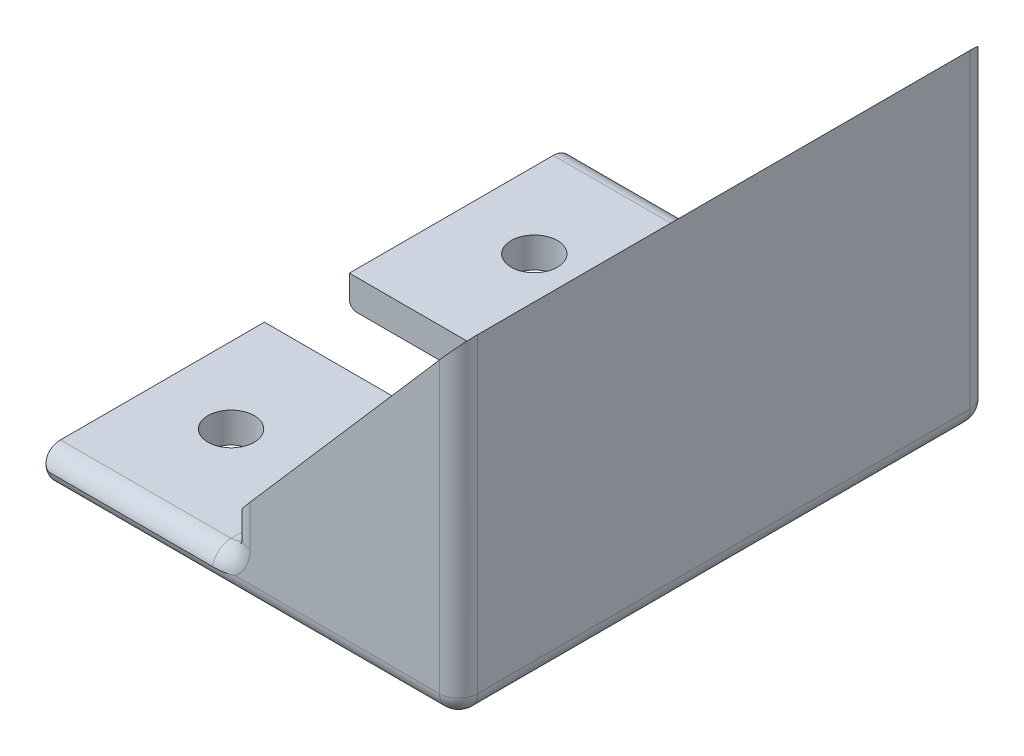
ISO-10303-21;
HEADER;
FILE_DESCRIPTION(('STEP AP214'),'2;1');
FILE_NAME('part.step','',(''),(''),'','','');
FILE_SCHEMA(('AUTOMOTIVE_DESIGN { 1 0 10303 214 1 1 1 1 }'));
ENDSEC;
DATA;
#1=APPLICATION_CONTEXT('core data for automotive mechanical design processes');
#2=APPLICATION_PROTOCOL_DEFINITION('international standard','automotive_design',2000,#1);
#3=PRODUCT_CONTEXT('',#1,'mechanical');
#4=PRODUCT('Part','Part','',(#3));
#5=PRODUCT_RELATED_PRODUCT_CATEGORY('part','',(#4));
#6=PRODUCT_DEFINITION_FORMATION('','',#4);
#7=PRODUCT_DEFINITION_CONTEXT('part definition',#1,'design');
#8=PRODUCT_DEFINITION('design','',#6,#7);
#9=PRODUCT_DEFINITION_SHAPE('','',#8);
#10=(LENGTH_UNIT() NAMED_UNIT(*) SI_UNIT(.MILLI.,.METRE.));
#11=(NAMED_UNIT(*) PLANE_ANGLE_UNIT() SI_UNIT($,.RADIAN.));
#12=(NAMED_UNIT(*) SI_UNIT($,.STERADIAN.) SOLID_ANGLE_UNIT());
#13=UNCERTAINTY_MEASURE_WITH_UNIT(LENGTH_MEASURE(1.E-05),#10,'distance_accuracy_value','');
#14=(GEOMETRIC_REPRESENTATION_CONTEXT(3) GLOBAL_UNCERTAINTY_ASSIGNED_CONTEXT((#13)) GLOBAL_UNIT_ASSIGNED_CONTEXT((#10,
#11,#12)) REPRESENTATION_CONTEXT('',''));
#15=CARTESIAN_POINT('',(0.,0.,0.));
#16=DIRECTION('',(0.,0.,1.));
#17=DIRECTION('',(1.,0.,0.));
#18=AXIS2_PLACEMENT_3D('',#15,#16,#17);
#19=CARTESIAN_POINT('',(-25.,-5.,35.));
#20=DIRECTION('',(0.,1.,0.));
#21=DIRECTION('',(0.,0.,1.));
#22=AXIS2_PLACEMENT_3D('',#19,#20,#21);
#23=PLANE('',#22);
#24=CARTESIAN_POINT('',(-15.,-5.,20.));
#25=DIRECTION('',(0.,1.,0.));
#26=DIRECTION('',(0.,0.,1.));
#27=AXIS2_PLACEMENT_3D('',#24,#25,#26);
#28=CIRCLE('',#27,3.05);
#29=CARTESIAN_POINT('',(-15.,-5.,23.05));
#30=VERTEX_POINT('',#29);
#31=EDGE_CURVE('E573',#30,#30,#28,.T.);
#32=ORIENTED_EDGE('',*,*,#31,.F.);
#33=EDGE_LOOP('',(#32));
#34=FACE_BOUND('',#33,.T.);
#35=DIRECTION('',(0.,0.,-1.));
#36=VECTOR('',#35,1.);
#37=CARTESIAN_POINT('',(-25.,-5.,35.));
#38=LINE('',#37,#36);
#39=CARTESIAN_POINT('',(-25.,-5.,32.5));
#40=VERTEX_POINT('',#39);
#41=CARTESIAN_POINT('',(-25.,-5.,5.6));
#42=VERTEX_POINT('',#41);
#43=EDGE_CURVE('E252',#40,#42,#38,.T.);
#44=ORIENTED_EDGE('',*,*,#43,.F.);
#45=DIRECTION('',(1.,0.,0.));
#46=VECTOR('',#45,1.);
#47=CARTESIAN_POINT('',(-25.,-5.,32.5));
#48=LINE('',#47,#46);
#49=CARTESIAN_POINT('',(-2.5,-5.,32.5));
#50=VERTEX_POINT('',#49);
#51=EDGE_CURVE('E325',#40,#50,#48,.T.);
#52=ORIENTED_EDGE('',*,*,#51,.T.);
#53=DIRECTION('',(0.,0.,-1.));
#54=VECTOR('',#53,1.);
#55=CARTESIAN_POINT('',(-2.5,-5.,35.));
#56=LINE('',#55,#54);
#57=CARTESIAN_POINT('',(-2.5,-5.,5.6));
#58=VERTEX_POINT('',#57);
#59=EDGE_CURVE('E322',#50,#58,#56,.T.);
#60=ORIENTED_EDGE('',*,*,#59,.T.);
#61=DIRECTION('',(1.,0.,0.));
#62=VECTOR('',#61,1.);
#63=CARTESIAN_POINT('',(-25.,-5.,5.6));
#64=LINE('',#63,#62);
#65=EDGE_CURVE('E233',#42,#58,#64,.T.);
#66=ORIENTED_EDGE('',*,*,#65,.F.);
#67=EDGE_LOOP('',(#44,#52,#60,#66));
#68=FACE_BOUND('',#67,.T.);
#69=ADVANCED_FACE('F43',(#34,#68),#23,.T.);
#70=CARTESIAN_POINT('',(-25.,-9.,35.));
#71=DIRECTION('',(-1.,0.,0.));
#72=DIRECTION('',(0.,0.,1.));
#73=AXIS2_PLACEMENT_3D('',#70,#71,#72);
#74=PLANE('',#73);
#75=DIRECTION('',(0.,0.,-1.));
#76=VECTOR('',#75,1.);
#77=CARTESIAN_POINT('',(-25.,-8.,35.));
#78=LINE('',#77,#76);
#79=CARTESIAN_POINT('',(-25.,-8.,5.6));
#80=VERTEX_POINT('',#79);
#81=CARTESIAN_POINT('',(-25.,-8.,32.5));
#82=VERTEX_POINT('',#81);
#83=EDGE_CURVE('E426',#80,#82,#78,.F.);
#84=ORIENTED_EDGE('',*,*,#83,.T.);
#85=CARTESIAN_POINT('',(-25.,-6.5,32.5));
#86=DIRECTION('',(-1.,0.,0.));
#87=DIRECTION('',(0.,0.,1.));
#88=AXIS2_PLACEMENT_3D('',#85,#86,#87);
#89=CIRCLE('',#88,1.5);
#90=EDGE_CURVE('E398',#82,#40,#89,.T.);
#91=ORIENTED_EDGE('',*,*,#90,.T.);
#92=ORIENTED_EDGE('',*,*,#43,.T.);
#93=DIRECTION('',(0.,-1.,0.));
#94=VECTOR('',#93,1.);
#95=CARTESIAN_POINT('',(-25.,-9.,5.6));
#96=LINE('',#95,#94);
#97=EDGE_CURVE('E223',#42,#80,#96,.T.);
#98=ORIENTED_EDGE('',*,*,#97,.T.);
#99=EDGE_LOOP('',(#84,#91,#92,#98));
#100=FACE_BOUND('',#99,.T.);
#101=ADVANCED_FACE('F450',(#100),#74,.T.);
#102=CARTESIAN_POINT('',(0.,0.,35.));
#103=DIRECTION('',(1.,0.,0.));
#104=DIRECTION('',(0.,1.,0.));
#105=AXIS2_PLACEMENT_3D('',#102,#103,#104);
#106=PLANE('',#105);
#107=DIRECTION('',(0.,0.,-1.));
#108=VECTOR('',#107,1.);
#109=CARTESIAN_POINT('',(0.,0.,35.));
#110=LINE('',#109,#108);
#111=CARTESIAN_POINT('',(0.,0.,32.5));
#112=VERTEX_POINT('',#111);
#113=CARTESIAN_POINT('',(0.,0.,-32.5));
#114=VERTEX_POINT('',#113);
#115=EDGE_CURVE('E241',#112,#114,#110,.T.);
#116=ORIENTED_EDGE('',*,*,#115,.T.);
#117=DIRECTION('',(0.,-1.,0.));
#118=VECTOR('',#117,1.);
#119=CARTESIAN_POINT('',(0.,0.,-32.5));
#120=LINE('',#119,#118);
#121=CARTESIAN_POINT('',(0.,-2.5,-32.5));
#122=VERTEX_POINT('',#121);
#123=EDGE_CURVE('E277',#114,#122,#120,.T.);
#124=ORIENTED_EDGE('',*,*,#123,.T.);
#125=DIRECTION('',(0.,0.,-1.));
#126=VECTOR('',#125,1.);
#127=CARTESIAN_POINT('',(0.,-2.5,35.));
#128=LINE('',#127,#126);
#129=CARTESIAN_POINT('',(0.,-2.5,-5.6));
#130=VERTEX_POINT('',#129);
#131=EDGE_CURVE('E274',#122,#130,#128,.F.);
#132=ORIENTED_EDGE('',*,*,#131,.T.);
#133=DIRECTION('',(0.,1.,0.));
#134=VECTOR('',#133,1.);
#135=CARTESIAN_POINT('',(0.,-8.99999999999999,-5.6));
#136=LINE('',#135,#134);
#137=CARTESIAN_POINT('',(0.,-9.,-5.6));
#138=VERTEX_POINT('',#137);
#139=EDGE_CURVE('E219',#138,#130,#136,.T.);
#140=ORIENTED_EDGE('',*,*,#139,.F.);
#141=DIRECTION('',(0.,0.,-1.));
#142=VECTOR('',#141,1.);
#143=CARTESIAN_POINT('',(0.,-9.,5.6));
#144=LINE('',#143,#142);
#145=CARTESIAN_POINT('',(0.,-9.,5.6));
#146=VERTEX_POINT('',#145);
#147=EDGE_CURVE('E197',#146,#138,#144,.T.);
#148=ORIENTED_EDGE('',*,*,#147,.F.);
#149=DIRECTION('',(0.,-1.,0.));
#150=VECTOR('',#149,1.);
#151=CARTESIAN_POINT('',(0.,-9.,5.6));
#152=LINE('',#151,#150);
#153=CARTESIAN_POINT('',(0.,-2.5,5.6));
#154=VERTEX_POINT('',#153);
#155=EDGE_CURVE('E205',#154,#146,#152,.T.);
#156=ORIENTED_EDGE('',*,*,#155,.F.);
#157=DIRECTION('',(0.,0.,-1.));
#158=VECTOR('',#157,1.);
#159=CARTESIAN_POINT('',(0.,-2.5,35.));
#160=LINE('',#159,#158);
#161=CARTESIAN_POINT('',(0.,-2.5,32.5));
#162=VERTEX_POINT('',#161);
#163=EDGE_CURVE('E268',#154,#162,#160,.F.);
#164=ORIENTED_EDGE('',*,*,#163,.T.);
#165=DIRECTION('',(0.,-1.,0.));
#166=VECTOR('',#165,1.);
#167=CARTESIAN_POINT('',(0.,0.,32.5));
#168=LINE('',#167,#166);
#169=EDGE_CURVE('E271',#162,#112,#168,.F.);
#170=ORIENTED_EDGE('',*,*,#169,.T.);
#171=EDGE_LOOP('',(#116,#124,#132,#140,#148,#156,#164,#170));
#172=FACE_BOUND('',#171,.T.);
#173=ADVANCED_FACE('F217',(#172),#106,.F.);
#174=CARTESIAN_POINT('',(-15.,-5.,-20.));
#175=DIRECTION('',(0.,1.,0.));
#176=DIRECTION('',(0.,0.,-1.));
#177=AXIS2_PLACEMENT_3D('',#174,#175,#176);
#178=CIRCLE('',#177,3.05);
#179=CARTESIAN_POINT('',(-15.,-5.,-23.05));
#180=VERTEX_POINT('',#179);
#181=EDGE_CURVE('E473',#180,#180,#178,.T.);
#182=ORIENTED_EDGE('',*,*,#181,.F.);
#183=EDGE_LOOP('',(#182));
#184=FACE_BOUND('',#183,.T.);
#185=DIRECTION('',(0.,0.,-1.));
#186=VECTOR('',#185,1.);
#187=CARTESIAN_POINT('',(-2.5,-5.,35.));
#188=LINE('',#187,#186);
#189=CARTESIAN_POINT('',(-2.5,-5.,-5.6));
#190=VERTEX_POINT('',#189);
#191=CARTESIAN_POINT('',(-2.5,-5.,-32.5));
#192=VERTEX_POINT('',#191);
#193=EDGE_CURVE('E328',#190,#192,#188,.T.);
#194=ORIENTED_EDGE('',*,*,#193,.T.);
#195=DIRECTION('',(1.,0.,0.));
#196=VECTOR('',#195,1.);
#197=CARTESIAN_POINT('',(-25.,-5.,-32.5));
#198=LINE('',#197,#196);
#199=CARTESIAN_POINT('',(-25.,-5.,-32.5));
#200=VERTEX_POINT('',#199);
#201=EDGE_CURVE('E331',#192,#200,#198,.F.);
#202=ORIENTED_EDGE('',*,*,#201,.T.);
#203=CARTESIAN_POINT('',(-25.,-5.,-5.6));
#204=VERTEX_POINT('',#203);
#205=EDGE_CURVE('E251',#204,#200,#38,.T.);
#206=ORIENTED_EDGE('',*,*,#205,.F.);
#207=DIRECTION('',(-1.,0.,0.));
#208=VECTOR('',#207,1.);
#209=CARTESIAN_POINT('',(-25.,-5.,-5.6));
#210=LINE('',#209,#208);
#211=EDGE_CURVE('E228',#190,#204,#210,.T.);
#212=ORIENTED_EDGE('',*,*,#211,.F.);
#213=EDGE_LOOP('',(#194,#202,#206,#212));
#214=FACE_BOUND('',#213,.T.);
#215=ADVANCED_FACE('F453',(#184,#214),#23,.T.);
#216=ORIENTED_EDGE('',*,*,#205,.T.);
#217=CARTESIAN_POINT('',(-25.,-6.5,-32.5));
#218=DIRECTION('',(-1.,0.,0.));
#219=DIRECTION('',(0.,0.,1.));
#220=AXIS2_PLACEMENT_3D('',#217,#218,#219);
#221=CIRCLE('',#220,1.5);
#222=CARTESIAN_POINT('',(-25.,-8.,-32.5));
#223=VERTEX_POINT('',#222);
#224=EDGE_CURVE('E504',#200,#223,#221,.T.);
#225=ORIENTED_EDGE('',*,*,#224,.T.);
#226=DIRECTION('',(0.,0.,-1.));
#227=VECTOR('',#226,1.);
#228=CARTESIAN_POINT('',(-25.,-8.,35.));
#229=LINE('',#228,#227);
#230=CARTESIAN_POINT('',(-25.,-8.,-5.6));
#231=VERTEX_POINT('',#230);
#232=EDGE_CURVE('E340',#223,#231,#229,.F.);
#233=ORIENTED_EDGE('',*,*,#232,.T.);
#234=DIRECTION('',(0.,1.,0.));
#235=VECTOR('',#234,1.);
#236=CARTESIAN_POINT('',(-25.,-8.99999999999999,-5.6));
#237=LINE('',#236,#235);
#238=EDGE_CURVE('E202',#231,#204,#237,.T.);
#239=ORIENTED_EDGE('',*,*,#238,.T.);
#240=EDGE_LOOP('',(#216,#225,#233,#239));
#241=FACE_BOUND('',#240,.T.);
#242=ADVANCED_FACE('F459',(#241),#74,.T.);
#243=CARTESIAN_POINT('',(30.,-9.,35.));
#244=DIRECTION('',(0.,-1.,0.));
#245=DIRECTION('',(1.,0.,0.));
#246=AXIS2_PLACEMENT_3D('',#243,#244,#245);
#247=PLANE('',#246);
#248=CARTESIAN_POINT('',(-15.,-9.,20.));
#249=DIRECTION('',(0.,1.,0.));
#250=DIRECTION('',(0.,0.,1.));
#251=AXIS2_PLACEMENT_3D('',#248,#249,#250);
#252=CIRCLE('',#251,3.05);
#253=CARTESIAN_POINT('',(-15.,-9.,23.05));
#254=VERTEX_POINT('',#253);
#255=EDGE_CURVE('E213',#254,#254,#252,.T.);
#256=ORIENTED_EDGE('',*,*,#255,.T.);
#257=EDGE_LOOP('',(#256));
#258=FACE_BOUND('',#257,.T.);
#259=CARTESIAN_POINT('',(-15.,-9.,-20.));
#260=DIRECTION('',(0.,1.,0.));
#261=DIRECTION('',(0.,0.,-1.));
#262=AXIS2_PLACEMENT_3D('',#259,#260,#261);
#263=CIRCLE('',#262,3.05);
#264=CARTESIAN_POINT('',(-15.,-9.,-23.05));
#265=VERTEX_POINT('',#264);
#266=EDGE_CURVE('E569',#265,#265,#263,.T.);
#267=ORIENTED_EDGE('',*,*,#266,.T.);
#268=EDGE_LOOP('',(#267));
#269=FACE_BOUND('',#268,.T.);
#270=DIRECTION('',(1.,0.,0.));
#271=VECTOR('',#270,1.);
#272=CARTESIAN_POINT('',(-25.,-8.99999999999999,-5.6));
#273=LINE('',#272,#271);
#274=CARTESIAN_POINT('',(-24.,-8.99999999999999,-5.6));
#275=VERTEX_POINT('',#274);
#276=EDGE_CURVE('E201',#275,#138,#273,.T.);
#277=ORIENTED_EDGE('',*,*,#276,.F.);
#278=DIRECTION('',(0.,0.,-1.));
#279=VECTOR('',#278,1.);
#280=CARTESIAN_POINT('',(-24.,-9.,35.));
#281=LINE('',#280,#279);
#282=CARTESIAN_POINT('',(-24.,-9.,-32.5));
#283=VERTEX_POINT('',#282);
#284=EDGE_CURVE('E544',#275,#283,#281,.T.);
#285=ORIENTED_EDGE('',*,*,#284,.T.);
#286=DIRECTION('',(-1.,0.,0.));
#287=VECTOR('',#286,1.);
#288=CARTESIAN_POINT('',(30.,-9.,-32.5));
#289=LINE('',#288,#287);
#290=CARTESIAN_POINT('',(27.5,-9.,-32.5));
#291=VERTEX_POINT('',#290);
#292=EDGE_CURVE('E313',#283,#291,#289,.F.);
#293=ORIENTED_EDGE('',*,*,#292,.T.);
#294=DIRECTION('',(0.,0.,-1.));
#295=VECTOR('',#294,1.);
#296=CARTESIAN_POINT('',(27.5,-9.,35.));
#297=LINE('',#296,#295);
#298=CARTESIAN_POINT('',(27.5,-9.,32.5));
#299=VERTEX_POINT('',#298);
#300=EDGE_CURVE('E316',#291,#299,#297,.F.);
#301=ORIENTED_EDGE('',*,*,#300,.T.);
#302=DIRECTION('',(-1.,0.,0.));
#303=VECTOR('',#302,1.);
#304=CARTESIAN_POINT('',(30.,-9.,32.5));
#305=LINE('',#304,#303);
#306=CARTESIAN_POINT('',(-24.,-9.,32.5));
#307=VERTEX_POINT('',#306);
#308=EDGE_CURVE('E319',#299,#307,#305,.T.);
#309=ORIENTED_EDGE('',*,*,#308,.T.);
#310=DIRECTION('',(0.,0.,-1.));
#311=VECTOR('',#310,1.);
#312=CARTESIAN_POINT('',(-24.,-9.,35.));
#313=LINE('',#312,#311);
#314=CARTESIAN_POINT('',(-24.,-9.,5.6));
#315=VERTEX_POINT('',#314);
#316=EDGE_CURVE('E68',#307,#315,#313,.T.);
#317=ORIENTED_EDGE('',*,*,#316,.T.);
#318=DIRECTION('',(1.,0.,0.));
#319=VECTOR('',#318,1.);
#320=CARTESIAN_POINT('',(-25.,-9.,5.6));
#321=LINE('',#320,#319);
#322=EDGE_CURVE('E193',#315,#146,#321,.T.);
#323=ORIENTED_EDGE('',*,*,#322,.T.);
#324=ORIENTED_EDGE('',*,*,#147,.T.);
#325=EDGE_LOOP('',(#277,#285,#293,#301,#309,#317,#323,#324));
#326=FACE_BOUND('',#325,.T.);
#327=ADVANCED_FACE('F195',(#258,#269,#326),#247,.T.);
#328=CARTESIAN_POINT('',(30.,34.5110522166304,35.));
#329=DIRECTION('',(1.,0.,0.));
#330=DIRECTION('',(0.,1.,0.));
#331=AXIS2_PLACEMENT_3D('',#328,#329,#330);
#332=PLANE('',#331);
#333=DIRECTION('',(0.,0.,-1.));
#334=VECTOR('',#333,1.);
#335=CARTESIAN_POINT('',(30.,-6.49999999999999,35.));
#336=LINE('',#335,#334);
#337=CARTESIAN_POINT('',(30.,-6.49999999999999,32.5));
#338=VERTEX_POINT('',#337);
#339=CARTESIAN_POINT('',(30.,-6.49999999999999,-32.5));
#340=VERTEX_POINT('',#339);
#341=EDGE_CURVE('E307',#338,#340,#336,.T.);
#342=ORIENTED_EDGE('',*,*,#341,.T.);
#343=DIRECTION('',(0.,-1.,0.));
#344=VECTOR('',#343,1.);
#345=CARTESIAN_POINT('',(30.,34.5110522166304,-32.5));
#346=LINE('',#345,#344);
#347=CARTESIAN_POINT('',(30.,34.5110522166304,-32.5));
#348=VERTEX_POINT('',#347);
#349=EDGE_CURVE('E310',#340,#348,#346,.F.);
#350=ORIENTED_EDGE('',*,*,#349,.T.);
#351=DIRECTION('',(0.,0.,-1.));
#352=VECTOR('',#351,1.);
#353=CARTESIAN_POINT('',(30.,34.5110522166304,35.));
#354=LINE('',#353,#352);
#355=CARTESIAN_POINT('',(30.,34.5110522166304,32.5));
#356=VERTEX_POINT('',#355);
#357=EDGE_CURVE('E247',#356,#348,#354,.T.);
#358=ORIENTED_EDGE('',*,*,#357,.F.);
#359=DIRECTION('',(0.,-1.,0.));
#360=VECTOR('',#359,1.);
#361=CARTESIAN_POINT('',(30.,34.5110522166304,32.5));
#362=LINE('',#361,#360);
#363=EDGE_CURVE('E304',#356,#338,#362,.T.);
#364=ORIENTED_EDGE('',*,*,#363,.T.);
#365=EDGE_LOOP('',(#342,#350,#358,#364));
#366=FACE_BOUND('',#365,.T.);
#367=ADVANCED_FACE('F609',(#366),#332,.T.);
#368=CARTESIAN_POINT('',(0.,0.,35.));
#369=DIRECTION('',(-0.754709580222773,0.656059028990506,0.));
#370=DIRECTION('',(-0.656059028990506,-0.754709580222773,0.));
#371=AXIS2_PLACEMENT_3D('',#368,#369,#370);
#372=PLANE('',#371);
#373=ORIENTED_EDGE('',*,*,#115,.F.);
#374=CARTESIAN_POINT('',(2.5,2.87592101805253,32.5));
#375=DIRECTION('',(-0.754709580222773,0.656059028990506,0.));
#376=DIRECTION('',(0.656059028990506,0.754709580222773,0.));
#377=AXIS2_PLACEMENT_3D('',#374,#375,#376);
#378=ELLIPSE('',#377,3.81063271676454,2.5);
#379=CARTESIAN_POINT('',(2.5,2.87592101805253,35.));
#380=VERTEX_POINT('',#379);
#381=EDGE_CURVE('E289',#112,#380,#378,.T.);
#382=ORIENTED_EDGE('',*,*,#381,.T.);
#383=DIRECTION('',(0.656059028990506,0.754709580222773,0.));
#384=VECTOR('',#383,1.);
#385=CARTESIAN_POINT('',(0.,0.,35.));
#386=LINE('',#385,#384);
#387=CARTESIAN_POINT('',(27.5,31.6351311985779,35.));
#388=VERTEX_POINT('',#387);
#389=EDGE_CURVE('E237',#380,#388,#386,.T.);
#390=ORIENTED_EDGE('',*,*,#389,.T.);
#391=CARTESIAN_POINT('',(27.5,31.6351311985779,32.5));
#392=DIRECTION('',(-0.754709580222773,0.656059028990506,0.));
#393=DIRECTION('',(-0.656059028990506,-0.754709580222773,0.));
#394=AXIS2_PLACEMENT_3D('',#391,#392,#393);
#395=ELLIPSE('',#394,3.81063271676454,2.5);
#396=EDGE_CURVE('E280',#388,#356,#395,.T.);
#397=ORIENTED_EDGE('',*,*,#396,.T.);
#398=ORIENTED_EDGE('',*,*,#357,.T.);
#399=CARTESIAN_POINT('',(27.5,31.6351311985779,-32.5));
#400=DIRECTION('',(-0.754709580222773,0.656059028990506,0.));
#401=DIRECTION('',(0.656059028990506,0.754709580222773,0.));
#402=AXIS2_PLACEMENT_3D('',#399,#400,#401);
#403=ELLIPSE('',#402,3.81063271676454,2.5);
#404=CARTESIAN_POINT('',(27.5,31.6351311985779,-35.));
#405=VERTEX_POINT('',#404);
#406=EDGE_CURVE('E283',#348,#405,#403,.T.);
#407=ORIENTED_EDGE('',*,*,#406,.T.);
#408=DIRECTION('',(0.656059028990506,0.754709580222773,0.));
#409=VECTOR('',#408,1.);
#410=CARTESIAN_POINT('',(0.,0.,-35.));
#411=LINE('',#410,#409);
#412=CARTESIAN_POINT('',(2.5,2.87592101805253,-35.));
#413=VERTEX_POINT('',#412);
#414=EDGE_CURVE('E236',#413,#405,#411,.T.);
#415=ORIENTED_EDGE('',*,*,#414,.F.);
#416=CARTESIAN_POINT('',(2.5,2.87592101805253,-32.5));
#417=DIRECTION('',(-0.754709580222773,0.656059028990506,0.));
#418=DIRECTION('',(-0.656059028990506,-0.754709580222773,0.));
#419=AXIS2_PLACEMENT_3D('',#416,#417,#418);
#420=ELLIPSE('',#419,3.81063271676454,2.5);
#421=EDGE_CURVE('E286',#413,#114,#420,.T.);
#422=ORIENTED_EDGE('',*,*,#421,.T.);
#423=EDGE_LOOP('',(#373,#382,#390,#397,#398,#407,#415,#422));
#424=FACE_BOUND('',#423,.T.);
#425=ADVANCED_FACE('F602',(#424),#372,.T.);
#426=CARTESIAN_POINT('',(0.,0.,35.));
#427=DIRECTION('',(0.,0.,1.));
#428=DIRECTION('',(1.,0.,0.));
#429=AXIS2_PLACEMENT_3D('',#426,#427,#428);
#430=PLANE('',#429);
#431=ORIENTED_EDGE('',*,*,#389,.F.);
#432=DIRECTION('',(0.,-1.,0.));
#433=VECTOR('',#432,1.);
#434=CARTESIAN_POINT('',(2.5,-5.,35.));
#435=LINE('',#434,#433);
#436=CARTESIAN_POINT('',(2.5,-2.5,35.));
#437=VERTEX_POINT('',#436);
#438=EDGE_CURVE('E264',#380,#437,#435,.T.);
#439=ORIENTED_EDGE('',*,*,#438,.T.);
#440=CARTESIAN_POINT('',(-2.5,-2.5,35.));
#441=DIRECTION('',(0.,0.,1.));
#442=DIRECTION('',(1.,0.,0.));
#443=AXIS2_PLACEMENT_3D('',#440,#441,#442);
#444=CIRCLE('',#443,5.);
#445=CARTESIAN_POINT('',(0.500000000000004,-6.5,35.));
#446=VERTEX_POINT('',#445);
#447=EDGE_CURVE('E261',#437,#446,#444,.F.);
#448=ORIENTED_EDGE('',*,*,#447,.T.);
#449=DIRECTION('',(-1.,0.,0.));
#450=VECTOR('',#449,1.);
#451=CARTESIAN_POINT('',(0.,-6.5,35.));
#452=LINE('',#451,#450);
#453=CARTESIAN_POINT('',(27.5,-6.5,35.));
#454=VERTEX_POINT('',#453);
#455=EDGE_CURVE('E255',#446,#454,#452,.F.);
#456=ORIENTED_EDGE('',*,*,#455,.T.);
#457=DIRECTION('',(0.,-1.,0.));
#458=VECTOR('',#457,1.);
#459=CARTESIAN_POINT('',(27.5,0.,35.));
#460=LINE('',#459,#458);
#461=EDGE_CURVE('E258',#454,#388,#460,.F.);
#462=ORIENTED_EDGE('',*,*,#461,.T.);
#463=EDGE_LOOP('',(#431,#439,#448,#456,#462));
#464=FACE_BOUND('',#463,.T.);
#465=ADVANCED_FACE('F599',(#464),#430,.T.);
#466=CARTESIAN_POINT('',(0.,0.,-35.));
#467=DIRECTION('',(0.,0.,1.));
#468=DIRECTION('',(1.,0.,0.));
#469=AXIS2_PLACEMENT_3D('',#466,#467,#468);
#470=PLANE('',#469);
#471=CARTESIAN_POINT('',(-2.5,-2.5,-35.));
#472=DIRECTION('',(0.,0.,1.));
#473=DIRECTION('',(1.,0.,0.));
#474=AXIS2_PLACEMENT_3D('',#471,#472,#473);
#475=CIRCLE('',#474,5.);
#476=CARTESIAN_POINT('',(0.500000000000004,-6.5,-35.));
#477=VERTEX_POINT('',#476);
#478=CARTESIAN_POINT('',(2.5,-2.5,-35.));
#479=VERTEX_POINT('',#478);
#480=EDGE_CURVE('E292',#477,#479,#475,.T.);
#481=ORIENTED_EDGE('',*,*,#480,.T.);
#482=DIRECTION('',(0.,-1.,0.));
#483=VECTOR('',#482,1.);
#484=CARTESIAN_POINT('',(2.5,0.,-35.));
#485=LINE('',#484,#483);
#486=EDGE_CURVE('E301',#479,#413,#485,.F.);
#487=ORIENTED_EDGE('',*,*,#486,.T.);
#488=ORIENTED_EDGE('',*,*,#414,.T.);
#489=DIRECTION('',(0.,-1.,0.));
#490=VECTOR('',#489,1.);
#491=CARTESIAN_POINT('',(27.5,-9.,-35.));
#492=LINE('',#491,#490);
#493=CARTESIAN_POINT('',(27.5,-6.5,-35.));
#494=VERTEX_POINT('',#493);
#495=EDGE_CURVE('E298',#405,#494,#492,.T.);
#496=ORIENTED_EDGE('',*,*,#495,.T.);
#497=DIRECTION('',(-1.,0.,0.));
#498=VECTOR('',#497,1.);
#499=CARTESIAN_POINT('',(-25.,-6.5,-35.));
#500=LINE('',#499,#498);
#501=EDGE_CURVE('E295',#494,#477,#500,.T.);
#502=ORIENTED_EDGE('',*,*,#501,.T.);
#503=EDGE_LOOP('',(#481,#487,#488,#496,#502));
#504=FACE_BOUND('',#503,.T.);
#505=ADVANCED_FACE('F598',(#504),#470,.F.);
#506=CARTESIAN_POINT('',(-25.,-9.,5.6));
#507=DIRECTION('',(0.,0.,1.));
#508=DIRECTION('',(1.,0.,0.));
#509=AXIS2_PLACEMENT_3D('',#506,#507,#508);
#510=PLANE('',#509);
#511=ORIENTED_EDGE('',*,*,#322,.F.);
#512=CARTESIAN_POINT('',(-24.,-8.,5.6));
#513=DIRECTION('',(0.,0.,1.));
#514=DIRECTION('',(1.,0.,0.));
#515=AXIS2_PLACEMENT_3D('',#512,#513,#514);
#516=CIRCLE('',#515,1.);
#517=EDGE_CURVE('E11',#315,#80,#516,.F.);
#518=ORIENTED_EDGE('',*,*,#517,.T.);
#519=ORIENTED_EDGE('',*,*,#97,.F.);
#520=ORIENTED_EDGE('',*,*,#65,.T.);
#521=CARTESIAN_POINT('',(-2.5,-2.5,5.6));
#522=DIRECTION('',(0.,0.,1.));
#523=DIRECTION('',(1.,0.,0.));
#524=AXIS2_PLACEMENT_3D('',#521,#522,#523);
#525=CIRCLE('',#524,2.5);
#526=EDGE_CURVE('E209',#58,#154,#525,.T.);
#527=ORIENTED_EDGE('',*,*,#526,.T.);
#528=ORIENTED_EDGE('',*,*,#155,.T.);
#529=EDGE_LOOP('',(#511,#518,#519,#520,#527,#528));
#530=FACE_BOUND('',#529,.T.);
#531=ADVANCED_FACE('F206',(#530),#510,.F.);
#532=CARTESIAN_POINT('',(-25.,-8.99999999999999,-5.6));
#533=DIRECTION('',(0.,0.,-1.));
#534=DIRECTION('',(0.,1.,0.));
#535=AXIS2_PLACEMENT_3D('',#532,#533,#534);
#536=PLANE('',#535);
#537=ORIENTED_EDGE('',*,*,#238,.F.);
#538=CARTESIAN_POINT('',(-24.,-8.,-5.6));
#539=DIRECTION('',(0.,0.,-1.));
#540=DIRECTION('',(0.,1.,0.));
#541=AXIS2_PLACEMENT_3D('',#538,#539,#540);
#542=CIRCLE('',#541,1.);
#543=EDGE_CURVE('E53',#231,#275,#542,.F.);
#544=ORIENTED_EDGE('',*,*,#543,.T.);
#545=ORIENTED_EDGE('',*,*,#276,.T.);
#546=ORIENTED_EDGE('',*,*,#139,.T.);
#547=CARTESIAN_POINT('',(-2.5,-2.5,-5.6));
#548=DIRECTION('',(0.,0.,-1.));
#549=DIRECTION('',(0.,1.,0.));
#550=AXIS2_PLACEMENT_3D('',#547,#548,#549);
#551=CIRCLE('',#550,2.5);
#552=EDGE_CURVE('E335',#130,#190,#551,.T.);
#553=ORIENTED_EDGE('',*,*,#552,.T.);
#554=ORIENTED_EDGE('',*,*,#211,.T.);
#555=EDGE_LOOP('',(#537,#544,#545,#546,#553,#554));
#556=FACE_BOUND('',#555,.T.);
#557=ADVANCED_FACE('F590',(#556),#536,.F.);
#558=CARTESIAN_POINT('',(-15.,-9.,-20.));
#559=DIRECTION('',(0.,1.,0.));
#560=DIRECTION('',(0.,0.,1.));
#561=AXIS2_PLACEMENT_3D('',#558,#559,#560);
#562=CYLINDRICAL_SURFACE('',#561,3.05);
#563=ORIENTED_EDGE('',*,*,#266,.F.);
#564=EDGE_LOOP('',(#563));
#565=FACE_BOUND('',#564,.T.);
#566=ORIENTED_EDGE('',*,*,#181,.T.);
#567=EDGE_LOOP('',(#566));
#568=FACE_BOUND('',#567,.T.);
#569=ADVANCED_FACE('F585',(#565,#568),#562,.F.);
#570=CARTESIAN_POINT('',(-15.,-9.,20.));
#571=DIRECTION('',(0.,1.,0.));
#572=DIRECTION('',(0.,0.,1.));
#573=AXIS2_PLACEMENT_3D('',#570,#571,#572);
#574=CYLINDRICAL_SURFACE('',#573,3.05);
#575=ORIENTED_EDGE('',*,*,#255,.F.);
#576=EDGE_LOOP('',(#575));
#577=FACE_BOUND('',#576,.T.);
#578=ORIENTED_EDGE('',*,*,#31,.T.);
#579=EDGE_LOOP('',(#578));
#580=FACE_BOUND('',#579,.T.);
#581=ADVANCED_FACE('F446',(#577,#580),#574,.F.);
#582=CARTESIAN_POINT('',(2.5,0.,-32.5));
#583=DIRECTION('',(0.,-1.,0.));
#584=DIRECTION('',(1.,0.,0.));
#585=AXIS2_PLACEMENT_3D('',#582,#583,#584);
#586=CYLINDRICAL_SURFACE('',#585,2.5);
#587=ORIENTED_EDGE('',*,*,#421,.F.);
#588=ORIENTED_EDGE('',*,*,#486,.F.);
#589=CARTESIAN_POINT('',(2.5,-2.5,-32.5));
#590=DIRECTION('',(0.,-1.,0.));
#591=DIRECTION('',(1.,0.,0.));
#592=AXIS2_PLACEMENT_3D('',#589,#590,#591);
#593=CIRCLE('',#592,2.5);
#594=EDGE_CURVE('E487',#122,#479,#593,.T.);
#595=ORIENTED_EDGE('',*,*,#594,.F.);
#596=ORIENTED_EDGE('',*,*,#123,.F.);
#597=EDGE_LOOP('',(#587,#588,#595,#596));
#598=FACE_BOUND('',#597,.T.);
#599=ADVANCED_FACE('F415',(#598),#586,.T.);
#600=CARTESIAN_POINT('',(-2.5,-2.5,35.));
#601=DIRECTION('',(0.,0.,-1.));
#602=DIRECTION('',(-1.,0.,0.));
#603=AXIS2_PLACEMENT_3D('',#600,#601,#602);
#604=CYLINDRICAL_SURFACE('',#603,2.5);
#605=ORIENTED_EDGE('',*,*,#552,.F.);
#606=ORIENTED_EDGE('',*,*,#131,.F.);
#607=CARTESIAN_POINT('',(-2.5,-2.5,-32.5));
#608=DIRECTION('',(0.,0.,1.));
#609=DIRECTION('',(1.,0.,0.));
#610=AXIS2_PLACEMENT_3D('',#607,#608,#609);
#611=CIRCLE('',#610,2.5);
#612=EDGE_CURVE('E482',#192,#122,#611,.T.);
#613=ORIENTED_EDGE('',*,*,#612,.F.);
#614=ORIENTED_EDGE('',*,*,#193,.F.);
#615=EDGE_LOOP('',(#605,#606,#613,#614));
#616=FACE_BOUND('',#615,.T.);
#617=ADVANCED_FACE('F437',(#616),#604,.F.);
#618=CARTESIAN_POINT('',(-2.5,-2.5,-32.5));
#619=DIRECTION('',(0.,0.,1.));
#620=DIRECTION('',(1.,0.,0.));
#621=AXIS2_PLACEMENT_3D('',#618,#619,#620);
#622=TOROIDAL_SURFACE('',#621,5.,2.5);
#623=CARTESIAN_POINT('',(-2.5,-7.5,-32.5));
#624=DIRECTION('',(1.,0.,0.));
#625=DIRECTION('',(0.,0.,-1.));
#626=AXIS2_PLACEMENT_3D('',#623,#624,#625);
#627=CIRCLE('',#626,2.5);
#628=CARTESIAN_POINT('',(-2.5,-7.,-34.9494897427832));
#629=VERTEX_POINT('',#628);
#630=EDGE_CURVE('E488',#192,#629,#627,.F.);
#631=ORIENTED_EDGE('',*,*,#630,.F.);
#632=ORIENTED_EDGE('',*,*,#612,.T.);
#633=ORIENTED_EDGE('',*,*,#594,.T.);
#634=ORIENTED_EDGE('',*,*,#480,.F.);
#635=CARTESIAN_POINT('',(-2.5002,-6.99999999777778,-34.9494897432368));
#636=CARTESIAN_POINT('',(-2.37261258090405,-7.00000976685394,-34.9494683180478));
#637=CARTESIAN_POINT('',(-2.24502871925655,-6.99729277519816,-34.9500419032741));
#638=CARTESIAN_POINT('',(-1.99011025623532,-6.98645688561193,-34.9522266145047));
#639=CARTESIAN_POINT('',(-1.86277563390686,-6.97833846325678,-34.9538376491651));
#640=CARTESIAN_POINT('',(-1.60858750545383,-6.95675235193907,-34.9579446310799));
#641=CARTESIAN_POINT('',(-1.48173395412004,-6.9432851788728,-34.9604404929885));
#642=CARTESIAN_POINT('',(-1.22871405704445,-6.91110236883992,-34.9660209065554));
#643=CARTESIAN_POINT('',(-1.10254771522599,-6.89238670194112,-34.969105461571));
#644=CARTESIAN_POINT('',(-0.728439682231576,-6.82906751859244,-34.9786184295511));
#645=CARTESIAN_POINT('',(-0.481737661628692,-6.77701781229302,-34.9853741231798));
#646=CARTESIAN_POINT('',(0.00686979219720503,-6.65418160997551,-34.9959978851492));
#647=CARTESIAN_POINT('',(0.248778111813388,-6.58340678151381,-34.999867745928));
#648=CARTESIAN_POINT('',(0.491834225553984,-6.50271915126138,-34.9999988824484));
#649=CARTESIAN_POINT('',(0.495917543158901,-6.50136082328495,-34.999999993308));
#650=CARTESIAN_POINT('',(0.500000000000004,-6.5,-35.));
#651=B_SPLINE_CURVE_WITH_KNOTS('',3,(#635,#636,#637,#638,#639,#640,#641,#642,#643,#644,#645,
#646,#647,#648,#649,#650),.UNSPECIFIED.,.F.,.F.,(4,2,2,2,2,2,2,4),(0.,0.382725919378159,
0.765418145663268,1.14807346958015,1.53073097582656,2.28658348710753,3.04196613407114,
3.05487608140838),.UNSPECIFIED.);
#652=EDGE_CURVE('E494',#629,#477,#651,.T.);
#653=ORIENTED_EDGE('',*,*,#652,.F.);
#654=EDGE_LOOP('',(#631,#632,#633,#634,#653));
#655=FACE_BOUND('',#654,.T.);
#656=ADVANCED_FACE('F434',(#655),#622,.T.);
#657=CARTESIAN_POINT('',(0.,-7.5,-32.5));
#658=DIRECTION('',(-1.,0.,0.));
#659=DIRECTION('',(0.,0.,1.));
#660=AXIS2_PLACEMENT_3D('',#657,#658,#659);
#661=CYLINDRICAL_SURFACE('',#660,2.5);
#662=DIRECTION('',(-1.,0.,0.));
#663=VECTOR('',#662,1.);
#664=CARTESIAN_POINT('',(-13.75,-7.,-34.9494897427832));
#665=LINE('',#664,#663);
#666=CARTESIAN_POINT('',(-24.,-7.,-34.9494897427832));
#667=VERTEX_POINT('',#666);
#668=EDGE_CURVE('E499',#667,#629,#665,.F.);
#669=ORIENTED_EDGE('',*,*,#668,.F.);
#670=CARTESIAN_POINT('',(-24.,-7.,-34.9494897427832));
#671=CARTESIAN_POINT('',(-24.0247229720308,-7.0000729270786,-34.949494235296));
#672=CARTESIAN_POINT('',(-24.0493467828492,-6.99771117344559,-34.9490230920221));
#673=CARTESIAN_POINT('',(-24.0974761231197,-6.98880512201165,-34.9471846704713));
#674=CARTESIAN_POINT('',(-24.1209920008312,-6.98231534883313,-34.9458290685782));
#675=CARTESIAN_POINT('',(-24.1725280900699,-6.96368656777465,-34.941817572674));
#676=CARTESIAN_POINT('',(-24.2001514424989,-6.95052396169929,-34.9389169385366));
#677=CARTESIAN_POINT('',(-24.2529956112176,-6.92012268391712,-34.9318695518475));
#678=CARTESIAN_POINT('',(-24.2782021937156,-6.90286172464473,-34.9277159508025));
#679=CARTESIAN_POINT('',(-24.3416383853153,-6.85354264016776,-34.915177056293));
#680=CARTESIAN_POINT('',(-24.3778029725577,-6.81911303011454,-34.9057890728025));
#681=CARTESIAN_POINT('',(-24.444735616147,-6.74628619688377,-34.8839834359045));
#682=CARTESIAN_POINT('',(-24.4754923078039,-6.70788088144277,-34.8715595303263));
#683=CARTESIAN_POINT('',(-24.5298351897459,-6.63290150014065,-34.8451144741759));
#684=CARTESIAN_POINT('',(-24.5538295118636,-6.59652095614583,-34.8313720955539));
#685=CARTESIAN_POINT('',(-24.5988670689796,-6.52291418680882,-34.8014969753562));
#686=CARTESIAN_POINT('',(-24.6199081842719,-6.48568737609112,-34.7853625337516));
#687=CARTESIAN_POINT('',(-24.6792980373383,-6.37358501782955,-34.7333708381821));
#688=CARTESIAN_POINT('',(-24.7138856375625,-6.29832862031407,-34.6939392198003));
#689=CARTESIAN_POINT('',(-24.7650117845019,-6.17468973140497,-34.6205888931528));
#690=CARTESIAN_POINT('',(-24.7837332677313,-6.12566587786864,-34.5891734132707));
#691=CARTESIAN_POINT('',(-24.8180952018629,-6.02920775839833,-34.5224267587039));
#692=CARTESIAN_POINT('',(-24.8337347254964,-5.98177397441981,-34.4870944105326));
#693=CARTESIAN_POINT('',(-24.8765386456882,-5.84275276423473,-34.3755280218979));
#694=CARTESIAN_POINT('',(-24.899630902991,-5.75433637604963,-34.2936606413111));
#695=CARTESIAN_POINT('',(-24.9372237756283,-5.58892398759338,-34.1163623019854));
#696=CARTESIAN_POINT('',(-24.9516614009326,-5.51201470247415,-34.0208380223297));
#697=CARTESIAN_POINT('',(-24.9737683038077,-5.37272010217867,-33.818984572883));
#698=CARTESIAN_POINT('',(-24.9814346744899,-5.31034103325313,-33.7126507844096));
#699=CARTESIAN_POINT('',(-24.9925613781124,-5.19770665069415,-33.4833578795802));
#700=CARTESIAN_POINT('',(-24.9956560161644,-5.14874010681334,-33.3597492825293));
#701=CARTESIAN_POINT('',(-24.9992177037731,-5.07103593116431,-33.10635402521));
#702=CARTESIAN_POINT('',(-24.9996867792536,-5.04228271746948,-32.9765722063023));
#703=CARTESIAN_POINT('',(-24.9999550842447,-5.0159897462156,-32.7881848268721));
#704=CARTESIAN_POINT('',(-24.9999827744169,-5.00999085310272,-32.7306543123326));
#705=CARTESIAN_POINT('',(-25.0000012934833,-5.0020005097569,-32.6154235213981));
#706=CARTESIAN_POINT('',(-24.9999921911071,-5.000001597886,-32.557723762545));
#707=CARTESIAN_POINT('',(-25.,-5.,-32.5));
#708=B_SPLINE_CURVE_WITH_KNOTS('',3,(#670,#671,#672,#673,#674,#675,#676,#677,#678,#679,#680,
#681,#682,#683,#684,#685,#686,#687,#688,#689,#690,#691,#692,#693,#694,#695,#696,#697,#698,#699,
#700,#701,#702,#703,#704,#705,#706,#707),.UNSPECIFIED.,.F.,.F.,(4,2,2,2,2,2,2,2,2,2,2,2,2,2,2,2,
2,2,4),(0.,0.0738922163742273,0.146828144879723,0.238520842021609,0.330724086608794,
0.482295661978957,0.634182053804863,0.771073732280615,0.908063169638845,1.18219475938847,
1.36548457128522,1.54882944564016,1.91512395727393,2.28405304363321,2.6531404337749,
3.05039900745294,3.44735100810088,3.62076362095081,3.79385244406424),.UNSPECIFIED.);
#709=EDGE_CURVE('E418',#667,#200,#708,.T.);
#710=ORIENTED_EDGE('',*,*,#709,.T.);
#711=ORIENTED_EDGE('',*,*,#201,.F.);
#712=ORIENTED_EDGE('',*,*,#630,.T.);
#713=EDGE_LOOP('',(#669,#710,#711,#712));
#714=FACE_BOUND('',#713,.T.);
#715=ADVANCED_FACE('F429',(#714),#661,.T.);
#716=CARTESIAN_POINT('',(27.5,0.,-32.5));
#717=DIRECTION('',(0.,1.,0.));
#718=DIRECTION('',(-1.,0.,0.));
#719=AXIS2_PLACEMENT_3D('',#716,#717,#718);
#720=CYLINDRICAL_SURFACE('',#719,2.5);
#721=ORIENTED_EDGE('',*,*,#406,.F.);
#722=ORIENTED_EDGE('',*,*,#349,.F.);
#723=CARTESIAN_POINT('',(27.5,-6.5,-32.5));
#724=DIRECTION('',(0.,-1.,0.));
#725=DIRECTION('',(1.,0.,0.));
#726=AXIS2_PLACEMENT_3D('',#723,#724,#725);
#727=CIRCLE('',#726,2.5);
#728=EDGE_CURVE('E835',#494,#340,#727,.T.);
#729=ORIENTED_EDGE('',*,*,#728,.F.);
#730=ORIENTED_EDGE('',*,*,#495,.F.);
#731=EDGE_LOOP('',(#721,#722,#729,#730));
#732=FACE_BOUND('',#731,.T.);
#733=ADVANCED_FACE('F433',(#732),#720,.T.);
#734=CARTESIAN_POINT('',(0.,-6.5,-32.5));
#735=DIRECTION('',(1.,0.,0.));
#736=DIRECTION('',(0.,1.,0.));
#737=AXIS2_PLACEMENT_3D('',#734,#735,#736);
#738=CYLINDRICAL_SURFACE('',#737,2.5);
#739=ORIENTED_EDGE('',*,*,#292,.F.);
#740=CARTESIAN_POINT('',(-24.,-6.5,-32.5));
#741=DIRECTION('',(-1.,0.,0.));
#742=DIRECTION('',(0.,0.,1.));
#743=AXIS2_PLACEMENT_3D('',#740,#741,#742);
#744=CIRCLE('',#743,2.5);
#745=EDGE_CURVE('E427',#283,#667,#744,.F.);
#746=ORIENTED_EDGE('',*,*,#745,.T.);
#747=ORIENTED_EDGE('',*,*,#668,.T.);
#748=ORIENTED_EDGE('',*,*,#652,.T.);
#749=ORIENTED_EDGE('',*,*,#501,.F.);
#750=CARTESIAN_POINT('',(27.5,-6.5,-32.5));
#751=DIRECTION('',(1.,0.,0.));
#752=DIRECTION('',(0.,0.,-1.));
#753=AXIS2_PLACEMENT_3D('',#750,#751,#752);
#754=CIRCLE('',#753,2.5);
#755=EDGE_CURVE('E539',#291,#494,#754,.T.);
#756=ORIENTED_EDGE('',*,*,#755,.F.);
#757=EDGE_LOOP('',(#739,#746,#747,#748,#749,#756));
#758=FACE_BOUND('',#757,.T.);
#759=ADVANCED_FACE('F524',(#758),#738,.T.);
#760=CARTESIAN_POINT('',(27.5,-6.5,-32.5));
#761=DIRECTION('',(0.,0.,-1.));
#762=DIRECTION('',(-1.,0.,0.));
#763=AXIS2_PLACEMENT_3D('',#760,#761,#762);
#764=SPHERICAL_SURFACE('',#763,2.5);
#765=ORIENTED_EDGE('',*,*,#755,.T.);
#766=ORIENTED_EDGE('',*,*,#728,.T.);
#767=CARTESIAN_POINT('',(27.5,-6.49999999999999,-32.5));
#768=DIRECTION('',(0.,0.,-1.));
#769=DIRECTION('',(-1.,0.,0.));
#770=AXIS2_PLACEMENT_3D('',#767,#768,#769);
#771=CIRCLE('',#770,2.5);
#772=EDGE_CURVE('E837',#291,#340,#771,.F.);
#773=ORIENTED_EDGE('',*,*,#772,.F.);
#774=EDGE_LOOP('',(#765,#766,#773));
#775=FACE_BOUND('',#774,.T.);
#776=ADVANCED_FACE('F526',(#775),#764,.T.);
#777=CARTESIAN_POINT('',(27.5,34.5110522166304,32.5));
#778=DIRECTION('',(0.,-1.,0.));
#779=DIRECTION('',(1.,0.,0.));
#780=AXIS2_PLACEMENT_3D('',#777,#778,#779);
#781=CYLINDRICAL_SURFACE('',#780,2.5);
#782=ORIENTED_EDGE('',*,*,#396,.F.);
#783=ORIENTED_EDGE('',*,*,#461,.F.);
#784=CARTESIAN_POINT('',(27.5,-6.49999999999999,32.5));
#785=DIRECTION('',(0.,-1.,0.));
#786=DIRECTION('',(0.,0.,-1.));
#787=AXIS2_PLACEMENT_3D('',#784,#785,#786);
#788=CIRCLE('',#787,2.5);
#789=EDGE_CURVE('E840',#338,#454,#788,.T.);
#790=ORIENTED_EDGE('',*,*,#789,.F.);
#791=ORIENTED_EDGE('',*,*,#363,.F.);
#792=EDGE_LOOP('',(#782,#783,#790,#791));
#793=FACE_BOUND('',#792,.T.);
#794=ADVANCED_FACE('F532',(#793),#781,.T.);
#795=CARTESIAN_POINT('',(27.5,-6.49999999999999,35.));
#796=DIRECTION('',(0.,0.,-1.));
#797=DIRECTION('',(-1.,0.,0.));
#798=AXIS2_PLACEMENT_3D('',#795,#796,#797);
#799=CYLINDRICAL_SURFACE('',#798,2.5);
#800=ORIENTED_EDGE('',*,*,#772,.T.);
#801=ORIENTED_EDGE('',*,*,#341,.F.);
#802=CARTESIAN_POINT('',(27.5,-6.5,32.5));
#803=DIRECTION('',(0.,0.,1.));
#804=DIRECTION('',(1.,0.,0.));
#805=AXIS2_PLACEMENT_3D('',#802,#803,#804);
#806=CIRCLE('',#805,2.5);
#807=EDGE_CURVE('E845',#299,#338,#806,.T.);
#808=ORIENTED_EDGE('',*,*,#807,.F.);
#809=ORIENTED_EDGE('',*,*,#300,.F.);
#810=EDGE_LOOP('',(#800,#801,#808,#809));
#811=FACE_BOUND('',#810,.T.);
#812=ADVANCED_FACE('F722',(#811),#799,.T.);
#813=CARTESIAN_POINT('',(27.5,-6.5,32.5));
#814=DIRECTION('',(1.,0.,0.));
#815=DIRECTION('',(0.,1.,0.));
#816=AXIS2_PLACEMENT_3D('',#813,#814,#815);
#817=SPHERICAL_SURFACE('',#816,2.5);
#818=ORIENTED_EDGE('',*,*,#807,.T.);
#819=ORIENTED_EDGE('',*,*,#789,.T.);
#820=CARTESIAN_POINT('',(27.5,-6.5,32.5));
#821=DIRECTION('',(1.,0.,0.));
#822=DIRECTION('',(0.,0.,-1.));
#823=AXIS2_PLACEMENT_3D('',#820,#821,#822);
#824=CIRCLE('',#823,2.5);
#825=EDGE_CURVE('E850',#299,#454,#824,.F.);
#826=ORIENTED_EDGE('',*,*,#825,.F.);
#827=EDGE_LOOP('',(#818,#819,#826));
#828=FACE_BOUND('',#827,.T.);
#829=ADVANCED_FACE('F372',(#828),#817,.T.);
#830=CARTESIAN_POINT('',(30.,-6.5,32.5));
#831=DIRECTION('',(-1.,0.,0.));
#832=DIRECTION('',(0.,-1.,0.));
#833=AXIS2_PLACEMENT_3D('',#830,#831,#832);
#834=CYLINDRICAL_SURFACE('',#833,2.5);
#835=DIRECTION('',(-1.,0.,0.));
#836=VECTOR('',#835,1.);
#837=CARTESIAN_POINT('',(1.25,-7.,34.9494897427832));
#838=LINE('',#837,#836);
#839=CARTESIAN_POINT('',(-24.,-7.,34.9494897427832));
#840=VERTEX_POINT('',#839);
#841=CARTESIAN_POINT('',(-2.49999999998952,-7.00000000000003,34.9494897427833));
#842=VERTEX_POINT('',#841);
#843=EDGE_CURVE('E363',#840,#842,#838,.F.);
#844=ORIENTED_EDGE('',*,*,#843,.F.);
#845=CARTESIAN_POINT('',(-24.,-6.5,32.5));
#846=DIRECTION('',(-1.,0.,0.));
#847=DIRECTION('',(0.,0.,1.));
#848=AXIS2_PLACEMENT_3D('',#845,#846,#847);
#849=CIRCLE('',#848,2.5);
#850=EDGE_CURVE('E397',#840,#307,#849,.F.);
#851=ORIENTED_EDGE('',*,*,#850,.T.);
#852=ORIENTED_EDGE('',*,*,#308,.F.);
#853=ORIENTED_EDGE('',*,*,#825,.T.);
#854=ORIENTED_EDGE('',*,*,#455,.F.);
#855=CARTESIAN_POINT('',(-2.5002,-6.99999999777778,34.9494897432368));
#856=CARTESIAN_POINT('',(-2.37261258090406,-7.00000976685394,34.9494683180478));
#857=CARTESIAN_POINT('',(-2.24502871925658,-6.99729277519816,34.9500419032741));
#858=CARTESIAN_POINT('',(-1.99011025623536,-6.98645688561193,34.9522266145047));
#859=CARTESIAN_POINT('',(-1.86277563390691,-6.97833846325678,34.9538376491651));
#860=CARTESIAN_POINT('',(-1.6085875054538,-6.95675235193907,34.9579446310799));
#861=CARTESIAN_POINT('',(-1.48173395411993,-6.94328517887278,34.9604404929885));
#862=CARTESIAN_POINT('',(-1.22871405704418,-6.91110236883988,34.9660209065554));
#863=CARTESIAN_POINT('',(-1.10254771522564,-6.89238670194109,34.969105461571));
#864=CARTESIAN_POINT('',(-0.728439682231223,-6.82906751859232,34.9786184295511));
#865=CARTESIAN_POINT('',(-0.481737661628451,-6.77701781229271,34.9853741231798));
#866=CARTESIAN_POINT('',(0.00686979219746264,-6.65418160997571,34.9959978851492));
#867=CARTESIAN_POINT('',(0.248778111813774,-6.58340678151471,34.999867745928));
#868=CARTESIAN_POINT('',(0.491834225553984,-6.50271915126141,34.9999988824484));
#869=CARTESIAN_POINT('',(0.495917543158901,-6.50136082328497,34.999999993308));
#870=CARTESIAN_POINT('',(0.500000000000003,-6.5,35.));
#871=B_SPLINE_CURVE_WITH_KNOTS('',3,(#855,#856,#857,#858,#859,#860,#861,#862,#863,#864,#865,
#866,#867,#868,#869,#870),.UNSPECIFIED.,.F.,.F.,(4,2,2,2,2,2,2,4),(0.,0.382725919378124,
0.765418145663222,1.14807346958034,1.53073097582698,2.28658348710781,3.04196613407113,
3.05487608140838),.UNSPECIFIED.);
#872=EDGE_CURVE('E353',#842,#446,#871,.T.);
#873=ORIENTED_EDGE('',*,*,#872,.F.);
#874=EDGE_LOOP('',(#844,#851,#852,#853,#854,#873));
#875=FACE_BOUND('',#874,.T.);
#876=ADVANCED_FACE('F367',(#875),#834,.T.);
#877=CARTESIAN_POINT('',(-25.,-7.5,32.5));
#878=DIRECTION('',(1.,0.,0.));
#879=DIRECTION('',(0.,0.,-1.));
#880=AXIS2_PLACEMENT_3D('',#877,#878,#879);
#881=CYLINDRICAL_SURFACE('',#880,2.5);
#882=ORIENTED_EDGE('',*,*,#51,.F.);
#883=CARTESIAN_POINT('',(-25.,-5.,32.5));
#884=CARTESIAN_POINT('',(-24.9999843335503,-4.99999562868556,32.5634389356385));
#885=CARTESIAN_POINT('',(-24.9999997185904,-5.0024147207355,32.6268753535059));
#886=CARTESIAN_POINT('',(-24.9999770597632,-5.0120653306264,32.7533756723689));
#887=CARTESIAN_POINT('',(-24.9999390204596,-5.01929643738065,32.8164396047214));
#888=CARTESIAN_POINT('',(-24.9996938475316,-5.03854996213346,32.941925607954));
#889=CARTESIAN_POINT('',(-24.9994864788771,-5.05057902784535,33.004346664499));
#890=CARTESIAN_POINT('',(-24.9986892977599,-5.07934793214688,33.1280793091555));
#891=CARTESIAN_POINT('',(-24.9980994571225,-5.09608811772778,33.1893908151905));
#892=CARTESIAN_POINT('',(-24.9951834452345,-5.1572933542558,33.3839786818363));
#893=CARTESIAN_POINT('',(-24.9916197347338,-5.21078935006023,33.5145254977729));
#894=CARTESIAN_POINT('',(-24.978154764891,-5.33879795933061,33.7644714124731));
#895=CARTESIAN_POINT('',(-24.9682575635383,-5.41329709859172,33.8838775931669));
#896=CARTESIAN_POINT('',(-24.9465001488096,-5.53745246494796,34.0501749209421));
#897=CARTESIAN_POINT('',(-24.9382587076176,-5.580216956574,34.102812911166));
#898=CARTESIAN_POINT('',(-24.9191807896564,-5.66961003744111,34.204180048062));
#899=CARTESIAN_POINT('',(-24.9083454006677,-5.71623700159571,34.2529108218336));
#900=CARTESIAN_POINT('',(-24.8837092703664,-5.81289468301187,34.3461269852776));
#901=CARTESIAN_POINT('',(-24.8699067395626,-5.86292744181866,34.3906097895029));
#902=CARTESIAN_POINT('',(-24.8389514683992,-5.9657274676845,34.4749523056367));
#903=CARTESIAN_POINT('',(-24.82179976524,-6.01849388445356,34.514813442747));
#904=CARTESIAN_POINT('',(-24.7741180577019,-6.15309536008611,34.6084298563141));
#905=CARTESIAN_POINT('',(-24.7411887366234,-6.23626116638497,34.6591538071649));
#906=CARTESIAN_POINT('',(-24.6837222581315,-6.36179059631997,34.7263754421996));
#907=CARTESIAN_POINT('',(-24.6632465216058,-6.40372037163232,34.7472883171768));
#908=CARTESIAN_POINT('',(-24.6191431199169,-6.48728323213042,34.7861578569356));
#909=CARTESIAN_POINT('',(-24.5955175626562,-6.52891649628603,34.8041164809418));
#910=CARTESIAN_POINT('',(-24.546272823989,-6.60823384755816,34.8359050884897));
#911=CARTESIAN_POINT('',(-24.5209035130504,-6.64599227030317,34.8499343935127));
#912=CARTESIAN_POINT('',(-24.4662015334671,-6.71956161386693,34.8753789178054));
#913=CARTESIAN_POINT('',(-24.4368673086236,-6.75537176222342,34.8867931058967));
#914=CARTESIAN_POINT('',(-24.3786653438903,-6.81763464953525,34.9052548280603));
#915=CARTESIAN_POINT('',(-24.350539619555,-6.84465085886809,34.9127133704639));
#916=CARTESIAN_POINT('',(-24.2903452517606,-6.89446977111711,34.9256937268508));
#917=CARTESIAN_POINT('',(-24.2582870045527,-6.91728320122482,34.931220504802));
#918=CARTESIAN_POINT('',(-24.2024271836951,-6.94907270161003,34.9385741080095));
#919=CARTESIAN_POINT('',(-24.1798625172451,-6.96006384568274,34.9410155521808));
#920=CARTESIAN_POINT('',(-24.1332602696765,-6.97842938522558,34.9450056692436));
#921=CARTESIAN_POINT('',(-24.1092275875478,-6.9858151421447,34.9465571493692));
#922=CARTESIAN_POINT('',(-24.0708350508275,-6.99396643397868,34.9482522872628));
#923=CARTESIAN_POINT('',(-24.0567950026239,-6.9962138223367,34.9487146597161));
#924=CARTESIAN_POINT('',(-24.0285076288524,-6.99923710589106,34.9493340489381));
#925=CARTESIAN_POINT('',(-24.0142597954162,-7.00000841497973,34.9494901140629));
#926=CARTESIAN_POINT('',(-24.,-7.,34.9494897427832));
#927=B_SPLINE_CURVE_WITH_KNOTS('',3,(#883,#884,#885,#886,#887,#888,#889,#890,#891,#892,#893,
#894,#895,#896,#897,#898,#899,#900,#901,#902,#903,#904,#905,#906,#907,#908,#909,#910,#911,#912,
#913,#914,#915,#916,#917,#918,#919,#920,#921,#922,#923,#924,#925,#926),.UNSPECIFIED.,.F.,.F.,(4,
2,2,2,2,2,2,2,2,2,2,2,2,2,2,2,2,2,2,2,2,4),(0.,0.190266021681572,0.380515791169797,
0.571030078093051,0.761558400766672,1.18272779290607,1.60362760352483,1.80835895038853,
2.01300459241914,2.21777400478807,2.42248010270098,2.72964252777974,2.88290905777895,
3.03607352982159,3.17867463544948,3.32133187434798,3.44013760251763,3.55863575692045,
3.63404188804967,3.70920883708008,3.7518131380501,3.79454959499804),.UNSPECIFIED.);
#928=EDGE_CURVE('E389',#40,#840,#927,.T.);
#929=ORIENTED_EDGE('',*,*,#928,.T.);
#930=ORIENTED_EDGE('',*,*,#843,.T.);
#931=CARTESIAN_POINT('',(-2.5,-7.5,32.5));
#932=DIRECTION('',(1.,0.,0.));
#933=DIRECTION('',(0.,0.,-1.));
#934=AXIS2_PLACEMENT_3D('',#931,#932,#933);
#935=CIRCLE('',#934,2.5);
#936=EDGE_CURVE('E349',#50,#842,#935,.T.);
#937=ORIENTED_EDGE('',*,*,#936,.F.);
#938=EDGE_LOOP('',(#882,#929,#930,#937));
#939=FACE_BOUND('',#938,.T.);
#940=ADVANCED_FACE('F371',(#939),#881,.T.);
#941=CARTESIAN_POINT('',(-2.5,-2.5,35.));
#942=DIRECTION('',(0.,0.,-1.));
#943=DIRECTION('',(-1.,0.,0.));
#944=AXIS2_PLACEMENT_3D('',#941,#942,#943);
#945=CYLINDRICAL_SURFACE('',#944,2.5);
#946=ORIENTED_EDGE('',*,*,#526,.F.);
#947=ORIENTED_EDGE('',*,*,#59,.F.);
#948=CARTESIAN_POINT('',(-2.5,-2.5,32.5));
#949=DIRECTION('',(0.,0.,1.));
#950=DIRECTION('',(1.,0.,0.));
#951=AXIS2_PLACEMENT_3D('',#948,#949,#950);
#952=CIRCLE('',#951,2.5);
#953=EDGE_CURVE('E344',#162,#50,#952,.F.);
#954=ORIENTED_EDGE('',*,*,#953,.F.);
#955=ORIENTED_EDGE('',*,*,#163,.F.);
#956=EDGE_LOOP('',(#946,#947,#954,#955));
#957=FACE_BOUND('',#956,.T.);
#958=ADVANCED_FACE('F378',(#957),#945,.F.);
#959=CARTESIAN_POINT('',(-2.5,-2.5,32.5));
#960=DIRECTION('',(0.,0.,1.));
#961=DIRECTION('',(1.,0.,0.));
#962=AXIS2_PLACEMENT_3D('',#959,#960,#961);
#963=TOROIDAL_SURFACE('',#962,5.,2.5);
#964=ORIENTED_EDGE('',*,*,#872,.T.);
#965=ORIENTED_EDGE('',*,*,#447,.F.);
#966=CARTESIAN_POINT('',(2.5,-2.5,32.5));
#967=DIRECTION('',(0.,-1.,0.));
#968=DIRECTION('',(1.,0.,0.));
#969=AXIS2_PLACEMENT_3D('',#966,#967,#968);
#970=CIRCLE('',#969,2.5);
#971=EDGE_CURVE('E341',#162,#437,#970,.F.);
#972=ORIENTED_EDGE('',*,*,#971,.F.);
#973=ORIENTED_EDGE('',*,*,#953,.T.);
#974=ORIENTED_EDGE('',*,*,#936,.T.);
#975=EDGE_LOOP('',(#964,#965,#972,#973,#974));
#976=FACE_BOUND('',#975,.T.);
#977=ADVANCED_FACE('F374',(#976),#963,.T.);
#978=CARTESIAN_POINT('',(2.5,0.,32.5));
#979=DIRECTION('',(0.,1.,0.));
#980=DIRECTION('',(-1.,0.,0.));
#981=AXIS2_PLACEMENT_3D('',#978,#979,#980);
#982=CYLINDRICAL_SURFACE('',#981,2.5);
#983=ORIENTED_EDGE('',*,*,#381,.F.);
#984=ORIENTED_EDGE('',*,*,#169,.F.);
#985=ORIENTED_EDGE('',*,*,#971,.T.);
#986=ORIENTED_EDGE('',*,*,#438,.F.);
#987=EDGE_LOOP('',(#983,#984,#985,#986));
#988=FACE_BOUND('',#987,.T.);
#989=ADVANCED_FACE('F377',(#988),#982,.T.);
#990=CARTESIAN_POINT('',(-24.,-8.,35.));
#991=DIRECTION('',(0.,0.,-1.));
#992=DIRECTION('',(-1.,0.,0.));
#993=AXIS2_PLACEMENT_3D('',#990,#991,#992);
#994=CYLINDRICAL_SURFACE('',#993,1.);
#995=ORIENTED_EDGE('',*,*,#543,.F.);
#996=ORIENTED_EDGE('',*,*,#232,.F.);
#997=CARTESIAN_POINT('',(-24.,-8.,-32.5));
#998=DIRECTION('',(0.,0.,-1.));
#999=DIRECTION('',(-1.,0.,0.));
#1000=AXIS2_PLACEMENT_3D('',#997,#998,#999);
#1001=CIRCLE('',#1000,1.);
#1002=EDGE_CURVE('E345',#283,#223,#1001,.T.);
#1003=ORIENTED_EDGE('',*,*,#1002,.F.);
#1004=ORIENTED_EDGE('',*,*,#284,.F.);
#1005=EDGE_LOOP('',(#995,#996,#1003,#1004));
#1006=FACE_BOUND('',#1005,.T.);
#1007=ADVANCED_FACE('F406',(#1006),#994,.T.);
#1008=CARTESIAN_POINT('',(-24.,-6.5,-32.5));
#1009=DIRECTION('',(-1.,0.,0.));
#1010=DIRECTION('',(0.,0.,1.));
#1011=AXIS2_PLACEMENT_3D('',#1008,#1009,#1010);
#1012=TOROIDAL_SURFACE('',#1011,1.5,1.);
#1013=ORIENTED_EDGE('',*,*,#709,.F.);
#1014=ORIENTED_EDGE('',*,*,#745,.F.);
#1015=ORIENTED_EDGE('',*,*,#1002,.T.);
#1016=ORIENTED_EDGE('',*,*,#224,.F.);
#1017=EDGE_LOOP('',(#1013,#1014,#1015,#1016));
#1018=FACE_BOUND('',#1017,.T.);
#1019=ADVANCED_FACE('F409',(#1018),#1012,.T.);
#1020=CARTESIAN_POINT('',(-24.,-8.,35.));
#1021=DIRECTION('',(0.,0.,-1.));
#1022=DIRECTION('',(-1.,0.,0.));
#1023=AXIS2_PLACEMENT_3D('',#1020,#1021,#1022);
#1024=CYLINDRICAL_SURFACE('',#1023,1.);
#1025=ORIENTED_EDGE('',*,*,#517,.F.);
#1026=ORIENTED_EDGE('',*,*,#316,.F.);
#1027=CARTESIAN_POINT('',(-24.,-8.,32.5));
#1028=DIRECTION('',(0.,0.,1.));
#1029=DIRECTION('',(1.,0.,0.));
#1030=AXIS2_PLACEMENT_3D('',#1027,#1028,#1029);
#1031=CIRCLE('',#1030,1.);
#1032=EDGE_CURVE('E47',#82,#307,#1031,.T.);
#1033=ORIENTED_EDGE('',*,*,#1032,.F.);
#1034=ORIENTED_EDGE('',*,*,#83,.F.);
#1035=EDGE_LOOP('',(#1025,#1026,#1033,#1034));
#1036=FACE_BOUND('',#1035,.T.);
#1037=ADVANCED_FACE('F45',(#1036),#1024,.T.);
#1038=CARTESIAN_POINT('',(-24.,-6.5,32.5));
#1039=DIRECTION('',(-1.,0.,0.));
#1040=DIRECTION('',(0.,0.,1.));
#1041=AXIS2_PLACEMENT_3D('',#1038,#1039,#1040);
#1042=TOROIDAL_SURFACE('',#1041,1.5,1.);
#1043=ORIENTED_EDGE('',*,*,#1032,.T.);
#1044=ORIENTED_EDGE('',*,*,#850,.F.);
#1045=ORIENTED_EDGE('',*,*,#928,.F.);
#1046=ORIENTED_EDGE('',*,*,#90,.F.);
#1047=EDGE_LOOP('',(#1043,#1044,#1045,#1046));
#1048=FACE_BOUND('',#1047,.T.);
#1049=ADVANCED_FACE('F401',(#1048),#1042,.T.);
#1050=CLOSED_SHELL('',(#69,#101,#173,#215,#242,#327,#367,#425,#465,#505,#531,#557,#569,#581,
#599,#617,#656,#715,#733,#759,#776,#794,#812,#829,#876,#940,#958,#977,#989,#1007,#1019,#1037,#1049));
#1051=MANIFOLD_SOLID_BREP('B2',#1050);
#1052=ADVANCED_BREP_SHAPE_REPRESENTATION('',(#18,#1051),#14);
#1053=SHAPE_DEFINITION_REPRESENTATION(#9,#1052);
ENDSEC;
END-ISO-10303-21;
